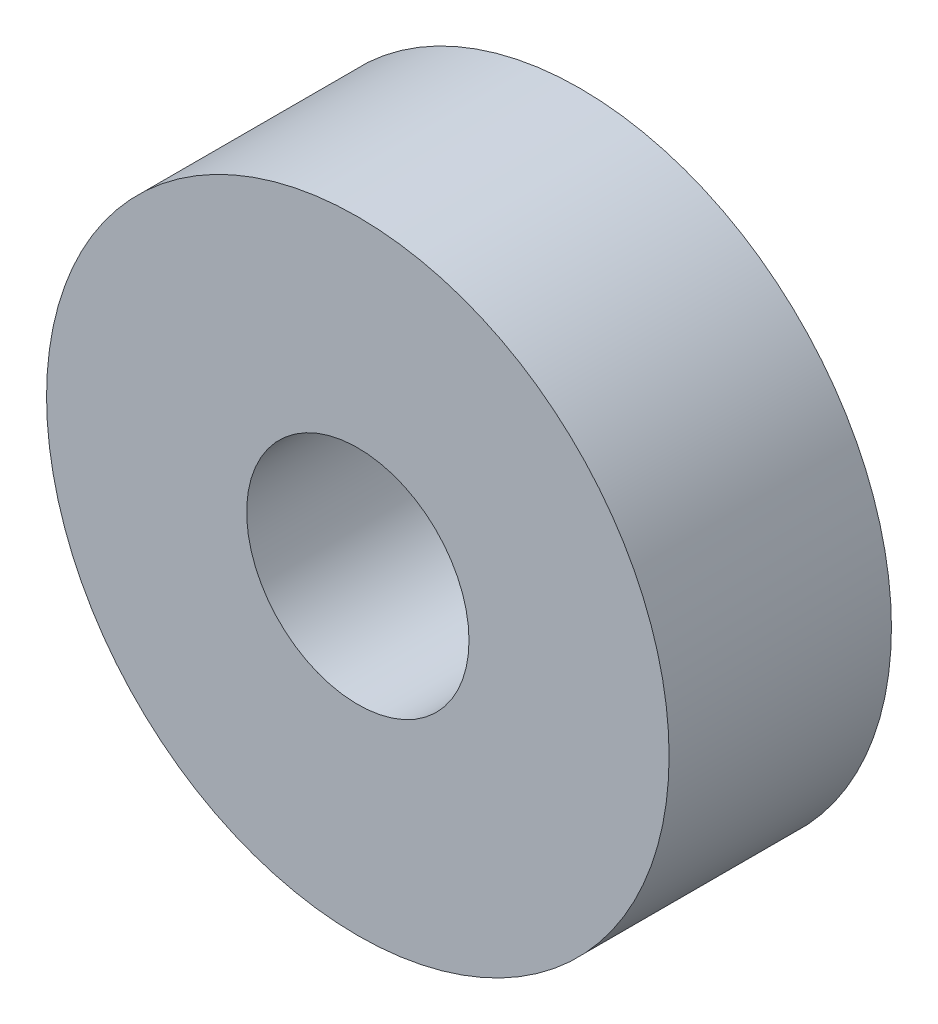
ISO-10303-21;
HEADER;
FILE_DESCRIPTION(('STEP AP214'),'2;1');
FILE_NAME('part.step','',(''),(''),'','','');
FILE_SCHEMA(('AUTOMOTIVE_DESIGN { 1 0 10303 214 1 1 1 1 }'));
ENDSEC;
DATA;
#1=APPLICATION_CONTEXT('core data for automotive mechanical design processes');
#2=APPLICATION_PROTOCOL_DEFINITION('international standard','automotive_design',2000,#1);
#3=PRODUCT_CONTEXT('',#1,'mechanical');
#4=PRODUCT('Part','Part','',(#3));
#5=PRODUCT_RELATED_PRODUCT_CATEGORY('part','',(#4));
#6=PRODUCT_DEFINITION_FORMATION('','',#4);
#7=PRODUCT_DEFINITION_CONTEXT('part definition',#1,'design');
#8=PRODUCT_DEFINITION('design','',#6,#7);
#9=PRODUCT_DEFINITION_SHAPE('','',#8);
#10=(LENGTH_UNIT() NAMED_UNIT(*) SI_UNIT(.MILLI.,.METRE.));
#11=(NAMED_UNIT(*) PLANE_ANGLE_UNIT() SI_UNIT($,.RADIAN.));
#12=(NAMED_UNIT(*) SI_UNIT($,.STERADIAN.) SOLID_ANGLE_UNIT());
#13=UNCERTAINTY_MEASURE_WITH_UNIT(LENGTH_MEASURE(1.E-05),#10,'distance_accuracy_value','');
#14=(GEOMETRIC_REPRESENTATION_CONTEXT(3) GLOBAL_UNCERTAINTY_ASSIGNED_CONTEXT((#13)) GLOBAL_UNIT_ASSIGNED_CONTEXT((#10,
#11,#12)) REPRESENTATION_CONTEXT('',''));
#15=CARTESIAN_POINT('',(0.,0.,0.));
#16=DIRECTION('',(0.,0.,1.));
#17=DIRECTION('',(1.,0.,0.));
#18=AXIS2_PLACEMENT_3D('',#15,#16,#17);
#19=CARTESIAN_POINT('',(0.,0.,0.));
#20=DIRECTION('',(0.,0.,1.));
#21=DIRECTION('',(1.,0.,0.));
#22=AXIS2_PLACEMENT_3D('',#19,#20,#21);
#23=CYLINDRICAL_SURFACE('',#22,7.);
#24=CARTESIAN_POINT('',(0.,0.,0.));
#25=DIRECTION('',(0.,0.,1.));
#26=DIRECTION('',(-1.,0.,0.));
#27=AXIS2_PLACEMENT_3D('',#24,#25,#26);
#28=CIRCLE('',#27,7.);
#29=CARTESIAN_POINT('',(-7.,0.,0.));
#30=VERTEX_POINT('',#29);
#31=EDGE_CURVE('E10',#30,#30,#28,.T.);
#32=ORIENTED_EDGE('',*,*,#31,.T.);
#33=EDGE_LOOP('',(#32));
#34=FACE_BOUND('',#33,.T.);
#35=CARTESIAN_POINT('',(0.,0.,5.));
#36=DIRECTION('',(0.,0.,1.));
#37=DIRECTION('',(-1.,0.,0.));
#38=AXIS2_PLACEMENT_3D('',#35,#36,#37);
#39=CIRCLE('',#38,7.);
#40=CARTESIAN_POINT('',(-7.,0.,5.));
#41=VERTEX_POINT('',#40);
#42=EDGE_CURVE('E33',#41,#41,#39,.T.);
#43=ORIENTED_EDGE('',*,*,#42,.F.);
#44=EDGE_LOOP('',(#43));
#45=FACE_BOUND('',#44,.T.);
#46=ADVANCED_FACE('F30',(#34,#45),#23,.T.);
#47=CARTESIAN_POINT('',(0.,0.,0.));
#48=DIRECTION('',(0.,0.,-1.));
#49=DIRECTION('',(-1.,0.,0.));
#50=AXIS2_PLACEMENT_3D('',#47,#48,#49);
#51=PLANE('',#50);
#52=CARTESIAN_POINT('',(0.,0.,0.));
#53=DIRECTION('',(0.,0.,1.));
#54=DIRECTION('',(1.,0.,0.));
#55=AXIS2_PLACEMENT_3D('',#52,#53,#54);
#56=CIRCLE('',#55,2.49999999999999);
#57=CARTESIAN_POINT('',(2.49999999999999,0.,0.));
#58=VERTEX_POINT('',#57);
#59=EDGE_CURVE('E40',#58,#58,#56,.T.);
#60=ORIENTED_EDGE('',*,*,#59,.T.);
#61=EDGE_LOOP('',(#60));
#62=FACE_BOUND('',#61,.T.);
#63=ORIENTED_EDGE('',*,*,#31,.F.);
#64=EDGE_LOOP('',(#63));
#65=FACE_BOUND('',#64,.T.);
#66=ADVANCED_FACE('F53',(#62,#65),#51,.T.);
#67=CARTESIAN_POINT('',(0.,0.,5.));
#68=DIRECTION('',(0.,0.,-1.));
#69=DIRECTION('',(-1.,0.,0.));
#70=AXIS2_PLACEMENT_3D('',#67,#68,#69);
#71=PLANE('',#70);
#72=CARTESIAN_POINT('',(0.,0.,5.));
#73=DIRECTION('',(0.,0.,1.));
#74=DIRECTION('',(1.,0.,0.));
#75=AXIS2_PLACEMENT_3D('',#72,#73,#74);
#76=CIRCLE('',#75,2.49999999999999);
#77=CARTESIAN_POINT('',(2.49999999999999,0.,5.));
#78=VERTEX_POINT('',#77);
#79=EDGE_CURVE('E44',#78,#78,#76,.T.);
#80=ORIENTED_EDGE('',*,*,#79,.F.);
#81=EDGE_LOOP('',(#80));
#82=FACE_BOUND('',#81,.T.);
#83=ORIENTED_EDGE('',*,*,#42,.T.);
#84=EDGE_LOOP('',(#83));
#85=FACE_BOUND('',#84,.T.);
#86=ADVANCED_FACE('F50',(#82,#85),#71,.F.);
#87=CARTESIAN_POINT('',(0.,0.,5.));
#88=DIRECTION('',(0.,0.,1.));
#89=DIRECTION('',(1.,0.,0.));
#90=AXIS2_PLACEMENT_3D('',#87,#88,#89);
#91=CYLINDRICAL_SURFACE('',#90,2.49999999999999);
#92=ORIENTED_EDGE('',*,*,#59,.F.);
#93=EDGE_LOOP('',(#92));
#94=FACE_BOUND('',#93,.T.);
#95=ORIENTED_EDGE('',*,*,#79,.T.);
#96=EDGE_LOOP('',(#95));
#97=FACE_BOUND('',#96,.T.);
#98=ADVANCED_FACE('F48',(#94,#97),#91,.F.);
#99=CLOSED_SHELL('',(#46,#66,#86,#98));
#100=MANIFOLD_SOLID_BREP('B2',#99);
#101=ADVANCED_BREP_SHAPE_REPRESENTATION('',(#18,#100),#14);
#102=SHAPE_DEFINITION_REPRESENTATION(#9,#101);
ENDSEC;
END-ISO-10303-21;
